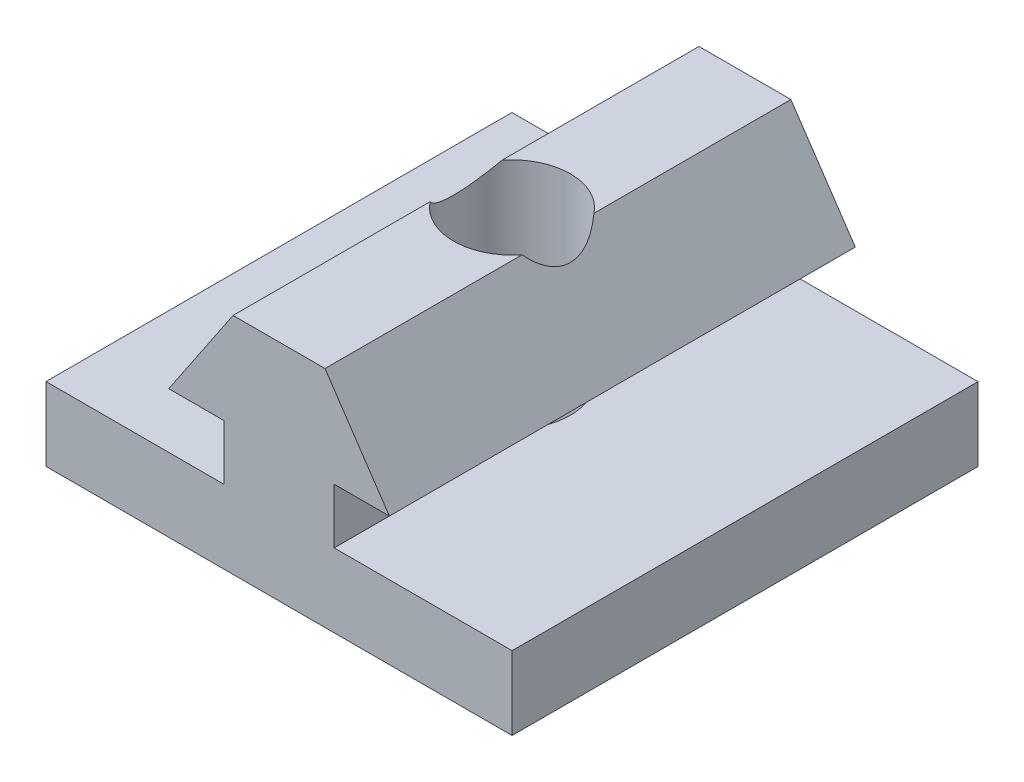
ISO-10303-21;
HEADER;
FILE_DESCRIPTION(('STEP AP214'),'2;1');
FILE_NAME('part.step','',(''),(''),'','','');
FILE_SCHEMA(('AUTOMOTIVE_DESIGN { 1 0 10303 214 1 1 1 1 }'));
ENDSEC;
DATA;
#1=APPLICATION_CONTEXT('core data for automotive mechanical design processes');
#2=APPLICATION_PROTOCOL_DEFINITION('international standard','automotive_design',2000,#1);
#3=PRODUCT_CONTEXT('',#1,'mechanical');
#4=PRODUCT('Part','Part','',(#3));
#5=PRODUCT_RELATED_PRODUCT_CATEGORY('part','',(#4));
#6=PRODUCT_DEFINITION_FORMATION('','',#4);
#7=PRODUCT_DEFINITION_CONTEXT('part definition',#1,'design');
#8=PRODUCT_DEFINITION('design','',#6,#7);
#9=PRODUCT_DEFINITION_SHAPE('','',#8);
#10=(LENGTH_UNIT() NAMED_UNIT(*) SI_UNIT(.MILLI.,.METRE.));
#11=(NAMED_UNIT(*) PLANE_ANGLE_UNIT() SI_UNIT($,.RADIAN.));
#12=(NAMED_UNIT(*) SI_UNIT($,.STERADIAN.) SOLID_ANGLE_UNIT());
#13=UNCERTAINTY_MEASURE_WITH_UNIT(LENGTH_MEASURE(1.E-05),#10,'distance_accuracy_value','');
#14=(GEOMETRIC_REPRESENTATION_CONTEXT(3) GLOBAL_UNCERTAINTY_ASSIGNED_CONTEXT((#13)) GLOBAL_UNIT_ASSIGNED_CONTEXT((#10,
#11,#12)) REPRESENTATION_CONTEXT('',''));
#15=CARTESIAN_POINT('',(0.,0.,0.));
#16=DIRECTION('',(0.,0.,1.));
#17=DIRECTION('',(1.,0.,0.));
#18=AXIS2_PLACEMENT_3D('',#15,#16,#17);
#19=CARTESIAN_POINT('',(3.,3.99999999999999,25.34));
#20=DIRECTION('',(-1.,0.,0.));
#21=DIRECTION('',(0.,-1.,0.));
#22=AXIS2_PLACEMENT_3D('',#19,#20,#21);
#23=PLANE('',#22);
#24=DIRECTION('',(0.,0.,-1.));
#25=VECTOR('',#24,1.);
#26=CARTESIAN_POINT('',(3.,6.99999999999999,25.34));
#27=LINE('',#26,#25);
#28=CARTESIAN_POINT('',(3.,6.99999999999999,11.6304688556854));
#29=VERTEX_POINT('',#28);
#30=CARTESIAN_POINT('',(3.,6.99999999999999,0.));
#31=VERTEX_POINT('',#30);
#32=EDGE_CURVE('E189',#29,#31,#27,.T.);
#33=ORIENTED_EDGE('',*,*,#32,.F.);
#34=DIRECTION('',(0.,-1.,0.));
#35=VECTOR('',#34,1.);
#36=CARTESIAN_POINT('',(3.,12.2,11.6304688556854));
#37=LINE('',#36,#35);
#38=CARTESIAN_POINT('',(3.,3.99999999999999,11.6304688556854));
#39=VERTEX_POINT('',#38);
#40=EDGE_CURVE('E47',#29,#39,#37,.T.);
#41=ORIENTED_EDGE('',*,*,#40,.T.);
#42=DIRECTION('',(0.,0.,-1.));
#43=VECTOR('',#42,1.);
#44=CARTESIAN_POINT('',(3.,3.99999999999999,25.34));
#45=LINE('',#44,#43);
#46=CARTESIAN_POINT('',(3.,3.99999999999999,0.));
#47=VERTEX_POINT('',#46);
#48=EDGE_CURVE('E193',#39,#47,#45,.T.);
#49=ORIENTED_EDGE('',*,*,#48,.T.);
#50=DIRECTION('',(0.,1.,0.));
#51=VECTOR('',#50,1.);
#52=CARTESIAN_POINT('',(3.,3.99999999999999,0.));
#53=LINE('',#52,#51);
#54=EDGE_CURVE('E234',#47,#31,#53,.T.);
#55=ORIENTED_EDGE('',*,*,#54,.T.);
#56=EDGE_LOOP('',(#33,#41,#49,#55));
#57=FACE_BOUND('',#56,.T.);
#58=ADVANCED_FACE('F32',(#57),#23,.F.);
#59=CARTESIAN_POINT('',(-2.5,12.2,25.34));
#60=DIRECTION('',(0.,-1.,0.));
#61=DIRECTION('',(0.,0.,-1.));
#62=AXIS2_PLACEMENT_3D('',#59,#60,#61);
#63=PLANE('',#62);
#64=DIRECTION('',(0.,0.,-1.));
#65=VECTOR('',#64,1.);
#66=CARTESIAN_POINT('',(2.5,12.2,25.34));
#67=LINE('',#66,#65);
#68=CARTESIAN_POINT('',(2.5,12.2,25.34));
#69=VERTEX_POINT('',#68);
#70=CARTESIAN_POINT('',(2.5,12.2,14.627198252605));
#71=VERTEX_POINT('',#70);
#72=EDGE_CURVE('E180',#69,#71,#67,.T.);
#73=ORIENTED_EDGE('',*,*,#72,.T.);
#74=CARTESIAN_POINT('',(0.,12.2,12.67));
#75=DIRECTION('',(0.,-1.,0.));
#76=DIRECTION('',(0.,0.,-1.));
#77=AXIS2_PLACEMENT_3D('',#74,#75,#76);
#78=CIRCLE('',#77,3.175);
#79=CARTESIAN_POINT('',(-2.5,12.2,14.627198252605));
#80=VERTEX_POINT('',#79);
#81=EDGE_CURVE('E158',#71,#80,#78,.T.);
#82=ORIENTED_EDGE('',*,*,#81,.T.);
#83=DIRECTION('',(0.,0.,-1.));
#84=VECTOR('',#83,1.);
#85=CARTESIAN_POINT('',(-2.5,12.2,25.34));
#86=LINE('',#85,#84);
#87=CARTESIAN_POINT('',(-2.5,12.2,25.34));
#88=VERTEX_POINT('',#87);
#89=EDGE_CURVE('E181',#88,#80,#86,.T.);
#90=ORIENTED_EDGE('',*,*,#89,.F.);
#91=DIRECTION('',(-1.,0.,0.));
#92=VECTOR('',#91,1.);
#93=CARTESIAN_POINT('',(-2.5,12.2,25.34));
#94=LINE('',#93,#92);
#95=EDGE_CURVE('E308',#69,#88,#94,.T.);
#96=ORIENTED_EDGE('',*,*,#95,.F.);
#97=EDGE_LOOP('',(#73,#82,#90,#96));
#98=FACE_BOUND('',#97,.T.);
#99=ADVANCED_FACE('F327',(#98),#63,.F.);
#100=CARTESIAN_POINT('',(-3.,3.99999999999999,25.34));
#101=DIRECTION('',(1.,0.,0.));
#102=DIRECTION('',(0.,1.,0.));
#103=AXIS2_PLACEMENT_3D('',#100,#101,#102);
#104=PLANE('',#103);
#105=DIRECTION('',(0.,0.,-1.));
#106=VECTOR('',#105,1.);
#107=CARTESIAN_POINT('',(-3.,6.99999999999999,25.34));
#108=LINE('',#107,#106);
#109=CARTESIAN_POINT('',(-3.,6.99999999999999,25.34));
#110=VERTEX_POINT('',#109);
#111=CARTESIAN_POINT('',(-3.,6.99999999999999,13.7095311443146));
#112=VERTEX_POINT('',#111);
#113=EDGE_CURVE('E259',#110,#112,#108,.T.);
#114=ORIENTED_EDGE('',*,*,#113,.T.);
#115=DIRECTION('',(0.,-1.,0.));
#116=VECTOR('',#115,1.);
#117=CARTESIAN_POINT('',(-3.,12.2,13.7095311443146));
#118=LINE('',#117,#116);
#119=CARTESIAN_POINT('',(-3.,3.99999999999999,13.7095311443146));
#120=VERTEX_POINT('',#119);
#121=EDGE_CURVE('E283',#112,#120,#118,.T.);
#122=ORIENTED_EDGE('',*,*,#121,.T.);
#123=DIRECTION('',(0.,0.,-1.));
#124=VECTOR('',#123,1.);
#125=CARTESIAN_POINT('',(-3.,3.99999999999999,25.34));
#126=LINE('',#125,#124);
#127=CARTESIAN_POINT('',(-3.,3.99999999999999,25.34));
#128=VERTEX_POINT('',#127);
#129=EDGE_CURVE('E255',#128,#120,#126,.T.);
#130=ORIENTED_EDGE('',*,*,#129,.F.);
#131=DIRECTION('',(0.,-1.,0.));
#132=VECTOR('',#131,1.);
#133=CARTESIAN_POINT('',(-3.,3.99999999999999,25.34));
#134=LINE('',#133,#132);
#135=EDGE_CURVE('E313',#110,#128,#134,.T.);
#136=ORIENTED_EDGE('',*,*,#135,.F.);
#137=EDGE_LOOP('',(#114,#122,#130,#136));
#138=FACE_BOUND('',#137,.T.);
#139=ADVANCED_FACE('F322',(#138),#104,.F.);
#140=CARTESIAN_POINT('',(-12.675,0.,25.34));
#141=DIRECTION('',(1.,0.,0.));
#142=DIRECTION('',(0.,0.,-1.));
#143=AXIS2_PLACEMENT_3D('',#140,#141,#142);
#144=PLANE('',#143);
#145=DIRECTION('',(0.,-1.,0.));
#146=VECTOR('',#145,1.);
#147=CARTESIAN_POINT('',(-12.675,0.,0.));
#148=LINE('',#147,#146);
#149=CARTESIAN_POINT('',(-12.675,4.,0.));
#150=VERTEX_POINT('',#149);
#151=CARTESIAN_POINT('',(-12.675,0.,0.));
#152=VERTEX_POINT('',#151);
#153=EDGE_CURVE('E215',#150,#152,#148,.T.);
#154=ORIENTED_EDGE('',*,*,#153,.T.);
#155=DIRECTION('',(0.,0.,-1.));
#156=VECTOR('',#155,1.);
#157=CARTESIAN_POINT('',(-12.675,0.,25.34));
#158=LINE('',#157,#156);
#159=CARTESIAN_POINT('',(-12.675,0.,25.34));
#160=VERTEX_POINT('',#159);
#161=EDGE_CURVE('E40',#160,#152,#158,.T.);
#162=ORIENTED_EDGE('',*,*,#161,.F.);
#163=DIRECTION('',(0.,-1.,0.));
#164=VECTOR('',#163,1.);
#165=CARTESIAN_POINT('',(-12.675,0.,25.34));
#166=LINE('',#165,#164);
#167=CARTESIAN_POINT('',(-12.675,4.,25.34));
#168=VERTEX_POINT('',#167);
#169=EDGE_CURVE('E252',#168,#160,#166,.T.);
#170=ORIENTED_EDGE('',*,*,#169,.F.);
#171=DIRECTION('',(0.,0.,-1.));
#172=VECTOR('',#171,1.);
#173=CARTESIAN_POINT('',(-12.675,4.,25.34));
#174=LINE('',#173,#172);
#175=EDGE_CURVE('E217',#168,#150,#174,.T.);
#176=ORIENTED_EDGE('',*,*,#175,.T.);
#177=EDGE_LOOP('',(#154,#162,#170,#176));
#178=FACE_BOUND('',#177,.T.);
#179=ADVANCED_FACE('F34',(#178),#144,.F.);
#180=CARTESIAN_POINT('',(12.675,0.,25.34));
#181=DIRECTION('',(0.,1.,0.));
#182=DIRECTION('',(0.,0.,1.));
#183=AXIS2_PLACEMENT_3D('',#180,#181,#182);
#184=PLANE('',#183);
#185=CARTESIAN_POINT('',(0.,0.,12.67));
#186=DIRECTION('',(0.,-1.,0.));
#187=DIRECTION('',(0.,0.,-1.));
#188=AXIS2_PLACEMENT_3D('',#185,#186,#187);
#189=CIRCLE('',#188,3.175);
#190=CARTESIAN_POINT('',(0.,0.,9.495));
#191=VERTEX_POINT('',#190);
#192=EDGE_CURVE('E173',#191,#191,#189,.T.);
#193=ORIENTED_EDGE('',*,*,#192,.F.);
#194=EDGE_LOOP('',(#193));
#195=FACE_BOUND('',#194,.T.);
#196=DIRECTION('',(1.,0.,0.));
#197=VECTOR('',#196,1.);
#198=CARTESIAN_POINT('',(12.675,0.,0.));
#199=LINE('',#198,#197);
#200=CARTESIAN_POINT('',(12.675,0.,0.));
#201=VERTEX_POINT('',#200);
#202=EDGE_CURVE('E208',#152,#201,#199,.T.);
#203=ORIENTED_EDGE('',*,*,#202,.T.);
#204=DIRECTION('',(0.,0.,-1.));
#205=VECTOR('',#204,1.);
#206=CARTESIAN_POINT('',(12.675,0.,25.34));
#207=LINE('',#206,#205);
#208=CARTESIAN_POINT('',(12.675,0.,25.34));
#209=VERTEX_POINT('',#208);
#210=EDGE_CURVE('E200',#209,#201,#207,.T.);
#211=ORIENTED_EDGE('',*,*,#210,.F.);
#212=DIRECTION('',(1.,0.,0.));
#213=VECTOR('',#212,1.);
#214=CARTESIAN_POINT('',(12.675,0.,25.34));
#215=LINE('',#214,#213);
#216=EDGE_CURVE('E209',#160,#209,#215,.T.);
#217=ORIENTED_EDGE('',*,*,#216,.F.);
#218=ORIENTED_EDGE('',*,*,#161,.T.);
#219=EDGE_LOOP('',(#203,#211,#217,#218));
#220=FACE_BOUND('',#219,.T.);
#221=ADVANCED_FACE('F206',(#195,#220),#184,.F.);
#222=CARTESIAN_POINT('',(12.675,0.,25.34));
#223=DIRECTION('',(-1.,0.,0.));
#224=DIRECTION('',(0.,0.,1.));
#225=AXIS2_PLACEMENT_3D('',#222,#223,#224);
#226=PLANE('',#225);
#227=DIRECTION('',(0.,1.,0.));
#228=VECTOR('',#227,1.);
#229=CARTESIAN_POINT('',(12.675,0.,0.));
#230=LINE('',#229,#228);
#231=CARTESIAN_POINT('',(12.675,4.,0.));
#232=VERTEX_POINT('',#231);
#233=EDGE_CURVE('E222',#201,#232,#230,.T.);
#234=ORIENTED_EDGE('',*,*,#233,.T.);
#235=DIRECTION('',(0.,0.,-1.));
#236=VECTOR('',#235,1.);
#237=CARTESIAN_POINT('',(12.675,4.,25.34));
#238=LINE('',#237,#236);
#239=CARTESIAN_POINT('',(12.675,4.,25.34));
#240=VERTEX_POINT('',#239);
#241=EDGE_CURVE('E197',#240,#232,#238,.T.);
#242=ORIENTED_EDGE('',*,*,#241,.F.);
#243=DIRECTION('',(0.,1.,0.));
#244=VECTOR('',#243,1.);
#245=CARTESIAN_POINT('',(12.675,0.,25.34));
#246=LINE('',#245,#244);
#247=EDGE_CURVE('E298',#209,#240,#246,.T.);
#248=ORIENTED_EDGE('',*,*,#247,.F.);
#249=ORIENTED_EDGE('',*,*,#210,.T.);
#250=EDGE_LOOP('',(#234,#242,#248,#249));
#251=FACE_BOUND('',#250,.T.);
#252=ADVANCED_FACE('F349',(#251),#226,.F.);
#253=CARTESIAN_POINT('',(12.675,4.,25.34));
#254=DIRECTION('',(0.,-1.,0.));
#255=DIRECTION('',(1.,0.,0.));
#256=AXIS2_PLACEMENT_3D('',#253,#254,#255);
#257=PLANE('',#256);
#258=ORIENTED_EDGE('',*,*,#48,.F.);
#259=CARTESIAN_POINT('',(0.,3.99999999999999,12.67));
#260=DIRECTION('',(0.,-1.,0.));
#261=DIRECTION('',(1.,0.,0.));
#262=AXIS2_PLACEMENT_3D('',#259,#260,#261);
#263=CIRCLE('',#262,3.175);
#264=CARTESIAN_POINT('',(3.,3.99999999999999,13.7095311443146));
#265=VERTEX_POINT('',#264);
#266=EDGE_CURVE('E220',#39,#265,#263,.T.);
#267=ORIENTED_EDGE('',*,*,#266,.T.);
#268=CARTESIAN_POINT('',(3.,3.99999999999999,25.34));
#269=VERTEX_POINT('',#268);
#270=EDGE_CURVE('E194',#269,#265,#45,.T.);
#271=ORIENTED_EDGE('',*,*,#270,.F.);
#272=DIRECTION('',(-1.,0.,0.));
#273=VECTOR('',#272,1.);
#274=CARTESIAN_POINT('',(12.675,4.,25.34));
#275=LINE('',#274,#273);
#276=EDGE_CURVE('E300',#240,#269,#275,.T.);
#277=ORIENTED_EDGE('',*,*,#276,.F.);
#278=ORIENTED_EDGE('',*,*,#241,.T.);
#279=DIRECTION('',(-1.,0.,0.));
#280=VECTOR('',#279,1.);
#281=CARTESIAN_POINT('',(12.675,4.,0.));
#282=LINE('',#281,#280);
#283=EDGE_CURVE('E231',#232,#47,#282,.T.);
#284=ORIENTED_EDGE('',*,*,#283,.T.);
#285=EDGE_LOOP('',(#258,#267,#271,#277,#278,#284));
#286=FACE_BOUND('',#285,.T.);
#287=ADVANCED_FACE('F343',(#286),#257,.F.);
#288=ORIENTED_EDGE('',*,*,#270,.T.);
#289=DIRECTION('',(0.,-1.,0.));
#290=VECTOR('',#289,1.);
#291=CARTESIAN_POINT('',(3.,12.2,13.7095311443146));
#292=LINE('',#291,#290);
#293=CARTESIAN_POINT('',(3.,6.99999999999999,13.7095311443146));
#294=VERTEX_POINT('',#293);
#295=EDGE_CURVE('E292',#265,#294,#292,.F.);
#296=ORIENTED_EDGE('',*,*,#295,.T.);
#297=CARTESIAN_POINT('',(3.,6.99999999999999,25.34));
#298=VERTEX_POINT('',#297);
#299=EDGE_CURVE('E190',#298,#294,#27,.T.);
#300=ORIENTED_EDGE('',*,*,#299,.F.);
#301=DIRECTION('',(0.,1.,0.));
#302=VECTOR('',#301,1.);
#303=CARTESIAN_POINT('',(3.,3.99999999999999,25.34));
#304=LINE('',#303,#302);
#305=EDGE_CURVE('E302',#269,#298,#304,.T.);
#306=ORIENTED_EDGE('',*,*,#305,.F.);
#307=EDGE_LOOP('',(#288,#296,#300,#306));
#308=FACE_BOUND('',#307,.T.);
#309=ADVANCED_FACE('F351',(#308),#23,.F.);
#310=CARTESIAN_POINT('',(3.,6.99999999999999,25.34));
#311=DIRECTION('',(0.,1.,0.));
#312=DIRECTION('',(-1.,0.,0.));
#313=AXIS2_PLACEMENT_3D('',#310,#311,#312);
#314=PLANE('',#313);
#315=ORIENTED_EDGE('',*,*,#299,.T.);
#316=CARTESIAN_POINT('',(0.,6.99999999999999,12.67));
#317=DIRECTION('',(0.,1.,0.));
#318=DIRECTION('',(-1.,0.,0.));
#319=AXIS2_PLACEMENT_3D('',#316,#317,#318);
#320=CIRCLE('',#319,3.175);
#321=EDGE_CURVE('E163',#294,#29,#320,.T.);
#322=ORIENTED_EDGE('',*,*,#321,.T.);
#323=ORIENTED_EDGE('',*,*,#32,.T.);
#324=DIRECTION('',(1.,0.,0.));
#325=VECTOR('',#324,1.);
#326=CARTESIAN_POINT('',(3.,6.99999999999999,0.));
#327=LINE('',#326,#325);
#328=CARTESIAN_POINT('',(6.,6.99999999999999,0.));
#329=VERTEX_POINT('',#328);
#330=EDGE_CURVE('E237',#31,#329,#327,.T.);
#331=ORIENTED_EDGE('',*,*,#330,.T.);
#332=DIRECTION('',(0.,0.,-1.));
#333=VECTOR('',#332,1.);
#334=CARTESIAN_POINT('',(6.,6.99999999999999,25.34));
#335=LINE('',#334,#333);
#336=CARTESIAN_POINT('',(6.,6.99999999999999,25.34));
#337=VERTEX_POINT('',#336);
#338=EDGE_CURVE('E183',#337,#329,#335,.T.);
#339=ORIENTED_EDGE('',*,*,#338,.F.);
#340=DIRECTION('',(1.,0.,0.));
#341=VECTOR('',#340,1.);
#342=CARTESIAN_POINT('',(3.,6.99999999999999,25.34));
#343=LINE('',#342,#341);
#344=EDGE_CURVE('E304',#298,#337,#343,.T.);
#345=ORIENTED_EDGE('',*,*,#344,.F.);
#346=EDGE_LOOP('',(#315,#322,#323,#331,#339,#345));
#347=FACE_BOUND('',#346,.T.);
#348=ADVANCED_FACE('F334',(#347),#314,.F.);
#349=CARTESIAN_POINT('',(6.,6.99999999999999,25.34));
#350=DIRECTION('',(-0.829587747619415,-0.558376368589991,0.));
#351=DIRECTION('',(0.558376368589991,-0.829587747619415,0.));
#352=AXIS2_PLACEMENT_3D('',#349,#350,#351);
#353=PLANE('',#352);
#354=CARTESIAN_POINT('',(2.5,12.2,10.712801747395));
#355=VERTEX_POINT('',#354);
#356=CARTESIAN_POINT('',(2.5,12.2,0.));
#357=VERTEX_POINT('',#356);
#358=EDGE_CURVE('E170',#355,#357,#67,.T.);
#359=ORIENTED_EDGE('',*,*,#358,.F.);
#360=CARTESIAN_POINT('',(0.,15.9142857142857,12.67));
#361=DIRECTION('',(-0.829587747619415,-0.558376368589991,0.));
#362=DIRECTION('',(0.558376368589991,-0.829587747619415,0.));
#363=AXIS2_PLACEMENT_3D('',#360,#361,#362);
#364=ELLIPSE('',#363,5.68612888832938,3.175);
#365=EDGE_CURVE('E155',#355,#71,#364,.T.);
#366=ORIENTED_EDGE('',*,*,#365,.T.);
#367=ORIENTED_EDGE('',*,*,#72,.F.);
#368=DIRECTION('',(-0.558376368589991,0.829587747619415,0.));
#369=VECTOR('',#368,1.);
#370=CARTESIAN_POINT('',(6.,6.99999999999999,25.34));
#371=LINE('',#370,#369);
#372=EDGE_CURVE('E306',#337,#69,#371,.T.);
#373=ORIENTED_EDGE('',*,*,#372,.F.);
#374=ORIENTED_EDGE('',*,*,#338,.T.);
#375=DIRECTION('',(-0.558376368589991,0.829587747619415,0.));
#376=VECTOR('',#375,1.);
#377=CARTESIAN_POINT('',(6.,6.99999999999999,0.));
#378=LINE('',#377,#376);
#379=EDGE_CURVE('E178',#329,#357,#378,.T.);
#380=ORIENTED_EDGE('',*,*,#379,.T.);
#381=EDGE_LOOP('',(#359,#366,#367,#373,#374,#380));
#382=FACE_BOUND('',#381,.T.);
#383=ADVANCED_FACE('F175',(#382),#353,.F.);
#384=CARTESIAN_POINT('',(-2.5,12.2,10.712801747395));
#385=VERTEX_POINT('',#384);
#386=CARTESIAN_POINT('',(-2.5,12.2,0.));
#387=VERTEX_POINT('',#386);
#388=EDGE_CURVE('E172',#385,#387,#86,.T.);
#389=ORIENTED_EDGE('',*,*,#388,.F.);
#390=EDGE_CURVE('E55',#385,#355,#78,.T.);
#391=ORIENTED_EDGE('',*,*,#390,.T.);
#392=ORIENTED_EDGE('',*,*,#358,.T.);
#393=DIRECTION('',(-1.,0.,0.));
#394=VECTOR('',#393,1.);
#395=CARTESIAN_POINT('',(-2.5,12.2,0.));
#396=LINE('',#395,#394);
#397=EDGE_CURVE('E240',#357,#387,#396,.T.);
#398=ORIENTED_EDGE('',*,*,#397,.T.);
#399=EDGE_LOOP('',(#389,#391,#392,#398));
#400=FACE_BOUND('',#399,.T.);
#401=ADVANCED_FACE('F168',(#400),#63,.F.);
#402=CARTESIAN_POINT('',(-6.,6.99999999999999,25.34));
#403=DIRECTION('',(0.829587747619415,-0.558376368589991,0.));
#404=DIRECTION('',(0.558376368589991,0.829587747619415,0.));
#405=AXIS2_PLACEMENT_3D('',#402,#403,#404);
#406=PLANE('',#405);
#407=ORIENTED_EDGE('',*,*,#89,.T.);
#408=CARTESIAN_POINT('',(0.,15.9142857142857,12.67));
#409=DIRECTION('',(0.829587747619415,-0.558376368589991,0.));
#410=DIRECTION('',(-0.558376368589991,-0.829587747619415,0.));
#411=AXIS2_PLACEMENT_3D('',#408,#409,#410);
#412=ELLIPSE('',#411,5.68612888832938,3.175);
#413=EDGE_CURVE('E164',#80,#385,#412,.T.);
#414=ORIENTED_EDGE('',*,*,#413,.T.);
#415=ORIENTED_EDGE('',*,*,#388,.T.);
#416=DIRECTION('',(-0.558376368589991,-0.829587747619415,0.));
#417=VECTOR('',#416,1.);
#418=CARTESIAN_POINT('',(-6.,6.99999999999999,0.));
#419=LINE('',#418,#417);
#420=CARTESIAN_POINT('',(-6.,6.99999999999999,0.));
#421=VERTEX_POINT('',#420);
#422=EDGE_CURVE('E242',#387,#421,#419,.T.);
#423=ORIENTED_EDGE('',*,*,#422,.T.);
#424=DIRECTION('',(0.,0.,-1.));
#425=VECTOR('',#424,1.);
#426=CARTESIAN_POINT('',(-6.,6.99999999999999,25.34));
#427=LINE('',#426,#425);
#428=CARTESIAN_POINT('',(-6.,6.99999999999999,25.34));
#429=VERTEX_POINT('',#428);
#430=EDGE_CURVE('E261',#429,#421,#427,.T.);
#431=ORIENTED_EDGE('',*,*,#430,.F.);
#432=DIRECTION('',(-0.558376368589991,-0.829587747619415,0.));
#433=VECTOR('',#432,1.);
#434=CARTESIAN_POINT('',(-6.,6.99999999999999,25.34));
#435=LINE('',#434,#433);
#436=EDGE_CURVE('E310',#88,#429,#435,.T.);
#437=ORIENTED_EDGE('',*,*,#436,.F.);
#438=EDGE_LOOP('',(#407,#414,#415,#423,#431,#437));
#439=FACE_BOUND('',#438,.T.);
#440=ADVANCED_FACE('F268',(#439),#406,.F.);
#441=CARTESIAN_POINT('',(-3.,6.99999999999999,25.34));
#442=DIRECTION('',(0.,1.,0.));
#443=DIRECTION('',(-1.,0.,0.));
#444=AXIS2_PLACEMENT_3D('',#441,#442,#443);
#445=PLANE('',#444);
#446=CARTESIAN_POINT('',(-3.,6.99999999999999,11.6304688556854));
#447=VERTEX_POINT('',#446);
#448=CARTESIAN_POINT('',(-3.,6.99999999999999,0.));
#449=VERTEX_POINT('',#448);
#450=EDGE_CURVE('E258',#447,#449,#108,.T.);
#451=ORIENTED_EDGE('',*,*,#450,.F.);
#452=CARTESIAN_POINT('',(0.,6.99999999999999,12.67));
#453=DIRECTION('',(0.,1.,0.));
#454=DIRECTION('',(-1.,0.,0.));
#455=AXIS2_PLACEMENT_3D('',#452,#453,#454);
#456=CIRCLE('',#455,3.175);
#457=EDGE_CURVE('E276',#447,#112,#456,.T.);
#458=ORIENTED_EDGE('',*,*,#457,.T.);
#459=ORIENTED_EDGE('',*,*,#113,.F.);
#460=DIRECTION('',(1.,0.,0.));
#461=VECTOR('',#460,1.);
#462=CARTESIAN_POINT('',(-3.,6.99999999999999,25.34));
#463=LINE('',#462,#461);
#464=EDGE_CURVE('E312',#429,#110,#463,.T.);
#465=ORIENTED_EDGE('',*,*,#464,.F.);
#466=ORIENTED_EDGE('',*,*,#430,.T.);
#467=DIRECTION('',(1.,0.,0.));
#468=VECTOR('',#467,1.);
#469=CARTESIAN_POINT('',(-3.,6.99999999999999,0.));
#470=LINE('',#469,#468);
#471=EDGE_CURVE('E244',#421,#449,#470,.T.);
#472=ORIENTED_EDGE('',*,*,#471,.T.);
#473=EDGE_LOOP('',(#451,#458,#459,#465,#466,#472));
#474=FACE_BOUND('',#473,.T.);
#475=ADVANCED_FACE('F273',(#474),#445,.F.);
#476=CARTESIAN_POINT('',(-3.,3.99999999999999,11.6304688556854));
#477=VERTEX_POINT('',#476);
#478=CARTESIAN_POINT('',(-3.,3.99999999999999,0.));
#479=VERTEX_POINT('',#478);
#480=EDGE_CURVE('E254',#477,#479,#126,.T.);
#481=ORIENTED_EDGE('',*,*,#480,.F.);
#482=DIRECTION('',(0.,-1.,0.));
#483=VECTOR('',#482,1.);
#484=CARTESIAN_POINT('',(-3.,12.2,11.6304688556854));
#485=LINE('',#484,#483);
#486=EDGE_CURVE('E281',#477,#447,#485,.F.);
#487=ORIENTED_EDGE('',*,*,#486,.T.);
#488=ORIENTED_EDGE('',*,*,#450,.T.);
#489=DIRECTION('',(0.,-1.,0.));
#490=VECTOR('',#489,1.);
#491=CARTESIAN_POINT('',(-3.,3.99999999999999,0.));
#492=LINE('',#491,#490);
#493=EDGE_CURVE('E247',#449,#479,#492,.T.);
#494=ORIENTED_EDGE('',*,*,#493,.T.);
#495=EDGE_LOOP('',(#481,#487,#488,#494));
#496=FACE_BOUND('',#495,.T.);
#497=ADVANCED_FACE('F280',(#496),#104,.F.);
#498=CARTESIAN_POINT('',(-12.675,4.,25.34));
#499=DIRECTION('',(0.,-1.,0.));
#500=DIRECTION('',(1.,0.,0.));
#501=AXIS2_PLACEMENT_3D('',#498,#499,#500);
#502=PLANE('',#501);
#503=ORIENTED_EDGE('',*,*,#129,.T.);
#504=CARTESIAN_POINT('',(0.,3.99999999999999,12.67));
#505=DIRECTION('',(0.,-1.,0.));
#506=DIRECTION('',(1.,0.,0.));
#507=AXIS2_PLACEMENT_3D('',#504,#505,#506);
#508=CIRCLE('',#507,3.175);
#509=EDGE_CURVE('E11',#120,#477,#508,.T.);
#510=ORIENTED_EDGE('',*,*,#509,.T.);
#511=ORIENTED_EDGE('',*,*,#480,.T.);
#512=DIRECTION('',(-1.,0.,0.));
#513=VECTOR('',#512,1.);
#514=CARTESIAN_POINT('',(-12.675,4.,0.));
#515=LINE('',#514,#513);
#516=EDGE_CURVE('E250',#479,#150,#515,.T.);
#517=ORIENTED_EDGE('',*,*,#516,.T.);
#518=ORIENTED_EDGE('',*,*,#175,.F.);
#519=DIRECTION('',(-1.,0.,0.));
#520=VECTOR('',#519,1.);
#521=CARTESIAN_POINT('',(-12.675,4.,25.34));
#522=LINE('',#521,#520);
#523=EDGE_CURVE('E227',#128,#168,#522,.T.);
#524=ORIENTED_EDGE('',*,*,#523,.F.);
#525=EDGE_LOOP('',(#503,#510,#511,#517,#518,#524));
#526=FACE_BOUND('',#525,.T.);
#527=ADVANCED_FACE('F320',(#526),#502,.F.);
#528=CARTESIAN_POINT('',(0.,0.,25.34));
#529=DIRECTION('',(0.,0.,-1.));
#530=DIRECTION('',(-1.,0.,0.));
#531=AXIS2_PLACEMENT_3D('',#528,#529,#530);
#532=PLANE('',#531);
#533=ORIENTED_EDGE('',*,*,#169,.T.);
#534=ORIENTED_EDGE('',*,*,#216,.T.);
#535=ORIENTED_EDGE('',*,*,#247,.T.);
#536=ORIENTED_EDGE('',*,*,#276,.T.);
#537=ORIENTED_EDGE('',*,*,#305,.T.);
#538=ORIENTED_EDGE('',*,*,#344,.T.);
#539=ORIENTED_EDGE('',*,*,#372,.T.);
#540=ORIENTED_EDGE('',*,*,#95,.T.);
#541=ORIENTED_EDGE('',*,*,#436,.T.);
#542=ORIENTED_EDGE('',*,*,#464,.T.);
#543=ORIENTED_EDGE('',*,*,#135,.T.);
#544=ORIENTED_EDGE('',*,*,#523,.T.);
#545=EDGE_LOOP('',(#533,#534,#535,#536,#537,#538,#539,#540,#541,#542,#543,#544));
#546=FACE_BOUND('',#545,.T.);
#547=ADVANCED_FACE('F318',(#546),#532,.F.);
#548=CARTESIAN_POINT('',(0.,0.,0.));
#549=DIRECTION('',(0.,0.,-1.));
#550=DIRECTION('',(-1.,0.,0.));
#551=AXIS2_PLACEMENT_3D('',#548,#549,#550);
#552=PLANE('',#551);
#553=ORIENTED_EDGE('',*,*,#153,.F.);
#554=ORIENTED_EDGE('',*,*,#516,.F.);
#555=ORIENTED_EDGE('',*,*,#493,.F.);
#556=ORIENTED_EDGE('',*,*,#471,.F.);
#557=ORIENTED_EDGE('',*,*,#422,.F.);
#558=ORIENTED_EDGE('',*,*,#397,.F.);
#559=ORIENTED_EDGE('',*,*,#379,.F.);
#560=ORIENTED_EDGE('',*,*,#330,.F.);
#561=ORIENTED_EDGE('',*,*,#54,.F.);
#562=ORIENTED_EDGE('',*,*,#283,.F.);
#563=ORIENTED_EDGE('',*,*,#233,.F.);
#564=ORIENTED_EDGE('',*,*,#202,.F.);
#565=EDGE_LOOP('',(#553,#554,#555,#556,#557,#558,#559,#560,#561,#562,#563,#564));
#566=FACE_BOUND('',#565,.T.);
#567=ADVANCED_FACE('F270',(#566),#552,.T.);
#568=CARTESIAN_POINT('',(0.,12.2,12.67));
#569=DIRECTION('',(0.,-1.,0.));
#570=DIRECTION('',(0.,0.,-1.));
#571=AXIS2_PLACEMENT_3D('',#568,#569,#570);
#572=CYLINDRICAL_SURFACE('',#571,3.175);
#573=ORIENTED_EDGE('',*,*,#192,.T.);
#574=EDGE_LOOP('',(#573));
#575=FACE_BOUND('',#574,.T.);
#576=ORIENTED_EDGE('',*,*,#486,.F.);
#577=ORIENTED_EDGE('',*,*,#509,.F.);
#578=ORIENTED_EDGE('',*,*,#121,.F.);
#579=ORIENTED_EDGE('',*,*,#457,.F.);
#580=EDGE_LOOP('',(#576,#577,#578,#579));
#581=FACE_BOUND('',#580,.T.);
#582=ORIENTED_EDGE('',*,*,#390,.F.);
#583=ORIENTED_EDGE('',*,*,#413,.F.);
#584=ORIENTED_EDGE('',*,*,#81,.F.);
#585=ORIENTED_EDGE('',*,*,#365,.F.);
#586=EDGE_LOOP('',(#582,#583,#584,#585));
#587=FACE_BOUND('',#586,.T.);
#588=ORIENTED_EDGE('',*,*,#40,.F.);
#589=ORIENTED_EDGE('',*,*,#321,.F.);
#590=ORIENTED_EDGE('',*,*,#295,.F.);
#591=ORIENTED_EDGE('',*,*,#266,.F.);
#592=EDGE_LOOP('',(#588,#589,#590,#591));
#593=FACE_BOUND('',#592,.T.);
#594=ADVANCED_FACE('F156',(#575,#581,#587,#593),#572,.F.);
#595=CLOSED_SHELL('',(#58,#99,#139,#179,#221,#252,#287,#309,#348,#383,#401,#440,#475,#497,#527,
#547,#567,#594));
#596=MANIFOLD_SOLID_BREP('B2',#595);
#597=ADVANCED_BREP_SHAPE_REPRESENTATION('',(#18,#596),#14);
#598=SHAPE_DEFINITION_REPRESENTATION(#9,#597);
ENDSEC;
END-ISO-10303-21;
